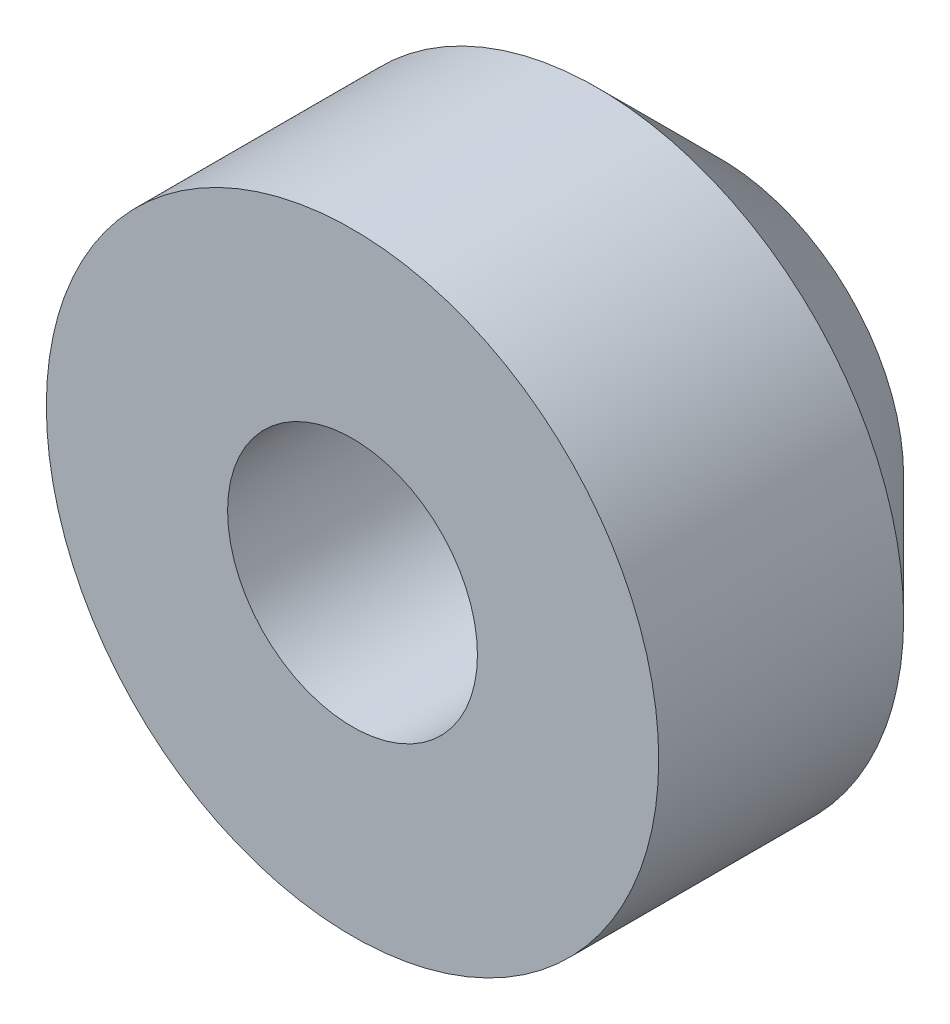
ISO-10303-21;
HEADER;
FILE_DESCRIPTION(('STEP AP214'),'2;1');
FILE_NAME('part.step','',(''),(''),'','','');
FILE_SCHEMA(('AUTOMOTIVE_DESIGN { 1 0 10303 214 1 1 1 1 }'));
ENDSEC;
DATA;
#1=APPLICATION_CONTEXT('core data for automotive mechanical design processes');
#2=APPLICATION_PROTOCOL_DEFINITION('international standard','automotive_design',2000,#1);
#3=PRODUCT_CONTEXT('',#1,'mechanical');
#4=PRODUCT('Part','Part','',(#3));
#5=PRODUCT_RELATED_PRODUCT_CATEGORY('part','',(#4));
#6=PRODUCT_DEFINITION_FORMATION('','',#4);
#7=PRODUCT_DEFINITION_CONTEXT('part definition',#1,'design');
#8=PRODUCT_DEFINITION('design','',#6,#7);
#9=PRODUCT_DEFINITION_SHAPE('','',#8);
#10=(LENGTH_UNIT() NAMED_UNIT(*) SI_UNIT(.MILLI.,.METRE.));
#11=(NAMED_UNIT(*) PLANE_ANGLE_UNIT() SI_UNIT($,.RADIAN.));
#12=(NAMED_UNIT(*) SI_UNIT($,.STERADIAN.) SOLID_ANGLE_UNIT());
#13=UNCERTAINTY_MEASURE_WITH_UNIT(LENGTH_MEASURE(1.E-05),#10,'distance_accuracy_value','');
#14=(GEOMETRIC_REPRESENTATION_CONTEXT(3) GLOBAL_UNCERTAINTY_ASSIGNED_CONTEXT((#13)) GLOBAL_UNIT_ASSIGNED_CONTEXT((#10,
#11,#12)) REPRESENTATION_CONTEXT('',''));
#15=CARTESIAN_POINT('',(0.,0.,0.));
#16=DIRECTION('',(0.,0.,1.));
#17=DIRECTION('',(1.,0.,0.));
#18=AXIS2_PLACEMENT_3D('',#15,#16,#17);
#19=CARTESIAN_POINT('',(0.,0.,15.));
#20=DIRECTION('',(0.,0.,1.));
#21=DIRECTION('',(1.,0.,0.));
#22=AXIS2_PLACEMENT_3D('',#19,#20,#21);
#23=PLANE('',#22);
#24=CARTESIAN_POINT('',(0.,0.,15.));
#25=DIRECTION('',(0.,0.,1.));
#26=DIRECTION('',(1.,0.,0.));
#27=AXIS2_PLACEMENT_3D('',#24,#25,#26);
#28=CIRCLE('',#27,12.5);
#29=CARTESIAN_POINT('',(12.5,0.,15.));
#30=VERTEX_POINT('',#29);
#31=EDGE_CURVE('E51',#30,#30,#28,.T.);
#32=ORIENTED_EDGE('',*,*,#31,.T.);
#33=EDGE_LOOP('',(#32));
#34=FACE_BOUND('',#33,.T.);
#35=CARTESIAN_POINT('',(0.,0.,15.));
#36=DIRECTION('',(0.,0.,1.));
#37=DIRECTION('',(1.,0.,0.));
#38=AXIS2_PLACEMENT_3D('',#35,#36,#37);
#39=CIRCLE('',#38,5.1);
#40=CARTESIAN_POINT('',(5.1,0.,15.));
#41=VERTEX_POINT('',#40);
#42=EDGE_CURVE('E55',#41,#41,#39,.T.);
#43=ORIENTED_EDGE('',*,*,#42,.F.);
#44=EDGE_LOOP('',(#43));
#45=FACE_BOUND('',#44,.T.);
#46=ADVANCED_FACE('F37',(#34,#45),#23,.T.);
#47=CARTESIAN_POINT('',(0.,0.,0.));
#48=DIRECTION('',(0.,0.,1.));
#49=DIRECTION('',(1.,0.,0.));
#50=AXIS2_PLACEMENT_3D('',#47,#48,#49);
#51=PLANE('',#50);
#52=CARTESIAN_POINT('',(0.,0.,0.));
#53=DIRECTION('',(0.,0.,1.));
#54=DIRECTION('',(1.,0.,0.));
#55=AXIS2_PLACEMENT_3D('',#52,#53,#54);
#56=CIRCLE('',#55,7.49999999999998);
#57=CARTESIAN_POINT('',(7.49999999999998,0.,0.));
#58=VERTEX_POINT('',#57);
#59=EDGE_CURVE('E10',#58,#58,#56,.F.);
#60=ORIENTED_EDGE('',*,*,#59,.T.);
#61=EDGE_LOOP('',(#60));
#62=FACE_BOUND('',#61,.T.);
#63=CARTESIAN_POINT('',(0.,0.,0.));
#64=DIRECTION('',(0.,0.,1.));
#65=DIRECTION('',(1.,0.,0.));
#66=AXIS2_PLACEMENT_3D('',#63,#64,#65);
#67=CIRCLE('',#66,5.1);
#68=CARTESIAN_POINT('',(5.1,0.,0.));
#69=VERTEX_POINT('',#68);
#70=EDGE_CURVE('E58',#69,#69,#67,.T.);
#71=ORIENTED_EDGE('',*,*,#70,.T.);
#72=EDGE_LOOP('',(#71));
#73=FACE_BOUND('',#72,.T.);
#74=ADVANCED_FACE('F68',(#62,#73),#51,.F.);
#75=CARTESIAN_POINT('',(0.,0.,15.));
#76=DIRECTION('',(0.,0.,-1.));
#77=DIRECTION('',(-1.,0.,0.));
#78=AXIS2_PLACEMENT_3D('',#75,#76,#77);
#79=CYLINDRICAL_SURFACE('',#78,12.5);
#80=CARTESIAN_POINT('',(0.,0.,5.00000000000001));
#81=DIRECTION('',(0.,0.,1.));
#82=DIRECTION('',(1.,0.,0.));
#83=AXIS2_PLACEMENT_3D('',#80,#81,#82);
#84=CIRCLE('',#83,12.5);
#85=CARTESIAN_POINT('',(12.5,0.,5.00000000000001));
#86=VERTEX_POINT('',#85);
#87=EDGE_CURVE('E46',#86,#86,#84,.T.);
#88=ORIENTED_EDGE('',*,*,#87,.T.);
#89=EDGE_LOOP('',(#88));
#90=FACE_BOUND('',#89,.T.);
#91=ORIENTED_EDGE('',*,*,#31,.F.);
#92=EDGE_LOOP('',(#91));
#93=FACE_BOUND('',#92,.T.);
#94=ADVANCED_FACE('F74',(#90,#93),#79,.T.);
#95=CARTESIAN_POINT('',(0.,0.,15.));
#96=DIRECTION('',(0.,0.,-1.));
#97=DIRECTION('',(-1.,0.,0.));
#98=AXIS2_PLACEMENT_3D('',#95,#96,#97);
#99=CYLINDRICAL_SURFACE('',#98,5.1);
#100=ORIENTED_EDGE('',*,*,#42,.T.);
#101=EDGE_LOOP('',(#100));
#102=FACE_BOUND('',#101,.T.);
#103=ORIENTED_EDGE('',*,*,#70,.F.);
#104=EDGE_LOOP('',(#103));
#105=FACE_BOUND('',#104,.T.);
#106=ADVANCED_FACE('F64',(#102,#105),#99,.F.);
#107=CARTESIAN_POINT('',(0.,0.,5.00000000000001));
#108=DIRECTION('',(0.,0.,1.));
#109=DIRECTION('',(1.,0.,0.));
#110=AXIS2_PLACEMENT_3D('',#107,#108,#109);
#111=CONICAL_SURFACE('',#110,12.5,0.78539816339745);
#112=ORIENTED_EDGE('',*,*,#59,.F.);
#113=EDGE_LOOP('',(#112));
#114=FACE_BOUND('',#113,.T.);
#115=ORIENTED_EDGE('',*,*,#87,.F.);
#116=EDGE_LOOP('',(#115));
#117=FACE_BOUND('',#116,.T.);
#118=ADVANCED_FACE('F40',(#114,#117),#111,.T.);
#119=CLOSED_SHELL('',(#46,#74,#94,#106,#118));
#120=MANIFOLD_SOLID_BREP('B2',#119);
#121=ADVANCED_BREP_SHAPE_REPRESENTATION('',(#18,#120),#14);
#122=SHAPE_DEFINITION_REPRESENTATION(#9,#121);
ENDSEC;
END-ISO-10303-21;
